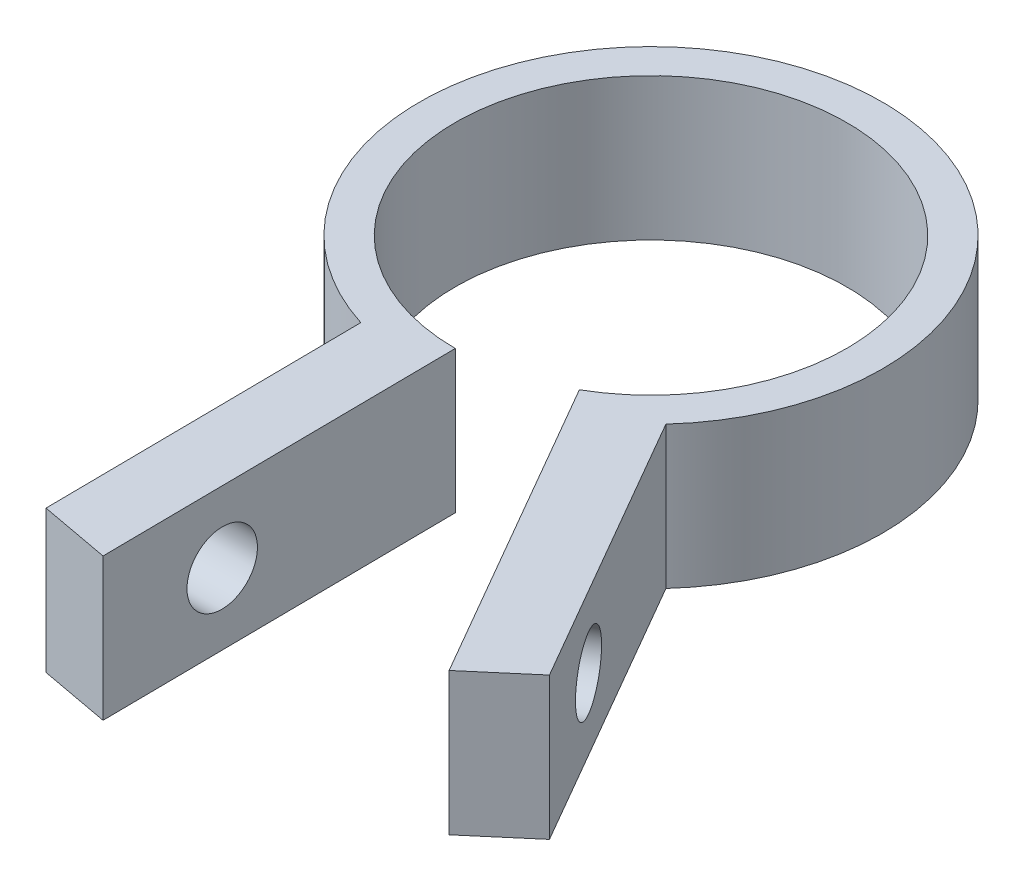
ISO-10303-21;
HEADER;
FILE_DESCRIPTION(('STEP AP214'),'2;1');
FILE_NAME('part.step','',(''),(''),'','','');
FILE_SCHEMA(('AUTOMOTIVE_DESIGN { 1 0 10303 214 1 1 1 1 }'));
ENDSEC;
DATA;
#1=APPLICATION_CONTEXT('core data for automotive mechanical design processes');
#2=APPLICATION_PROTOCOL_DEFINITION('international standard','automotive_design',2000,#1);
#3=PRODUCT_CONTEXT('',#1,'mechanical');
#4=PRODUCT('Part','Part','',(#3));
#5=PRODUCT_RELATED_PRODUCT_CATEGORY('part','',(#4));
#6=PRODUCT_DEFINITION_FORMATION('','',#4);
#7=PRODUCT_DEFINITION_CONTEXT('part definition',#1,'design');
#8=PRODUCT_DEFINITION('design','',#6,#7);
#9=PRODUCT_DEFINITION_SHAPE('','',#8);
#10=(LENGTH_UNIT() NAMED_UNIT(*) SI_UNIT(.MILLI.,.METRE.));
#11=(NAMED_UNIT(*) PLANE_ANGLE_UNIT() SI_UNIT($,.RADIAN.));
#12=(NAMED_UNIT(*) SI_UNIT($,.STERADIAN.) SOLID_ANGLE_UNIT());
#13=UNCERTAINTY_MEASURE_WITH_UNIT(LENGTH_MEASURE(1.E-05),#10,'distance_accuracy_value','');
#14=(GEOMETRIC_REPRESENTATION_CONTEXT(3) GLOBAL_UNCERTAINTY_ASSIGNED_CONTEXT((#13)) GLOBAL_UNIT_ASSIGNED_CONTEXT((#10,
#11,#12)) REPRESENTATION_CONTEXT('',''));
#15=CARTESIAN_POINT('',(0.,0.,0.));
#16=DIRECTION('',(0.,0.,1.));
#17=DIRECTION('',(1.,0.,0.));
#18=AXIS2_PLACEMENT_3D('',#15,#16,#17);
#19=CARTESIAN_POINT('',(0.,4.,0.));
#20=DIRECTION('',(0.,-1.,0.));
#21=DIRECTION('',(0.,0.,-1.));
#22=AXIS2_PLACEMENT_3D('',#19,#20,#21);
#23=CYLINDRICAL_SURFACE('',#22,5.5);
#24=CARTESIAN_POINT('',(0.,0.,0.));
#25=DIRECTION('',(0.,1.,0.));
#26=DIRECTION('',(0.,0.,1.));
#27=AXIS2_PLACEMENT_3D('',#24,#25,#26);
#28=CIRCLE('',#27,5.5);
#29=CARTESIAN_POINT('',(2.75000000000001,0.,4.76313972081441));
#30=VERTEX_POINT('',#29);
#31=CARTESIAN_POINT('',(0.,0.,5.5));
#32=VERTEX_POINT('',#31);
#33=EDGE_CURVE('E131',#30,#32,#28,.T.);
#34=ORIENTED_EDGE('',*,*,#33,.F.);
#35=DIRECTION('',(0.,-1.,0.));
#36=VECTOR('',#35,1.);
#37=CARTESIAN_POINT('',(2.75000000000001,4.,4.76313972081441));
#38=LINE('',#37,#36);
#39=CARTESIAN_POINT('',(2.75000000000001,4.,4.76313972081441));
#40=VERTEX_POINT('',#39);
#41=EDGE_CURVE('E11',#40,#30,#38,.T.);
#42=ORIENTED_EDGE('',*,*,#41,.F.);
#43=CARTESIAN_POINT('',(0.,4.,0.));
#44=DIRECTION('',(0.,1.,0.));
#45=DIRECTION('',(0.,0.,1.));
#46=AXIS2_PLACEMENT_3D('',#43,#44,#45);
#47=CIRCLE('',#46,5.5);
#48=CARTESIAN_POINT('',(0.,4.,5.5));
#49=VERTEX_POINT('',#48);
#50=EDGE_CURVE('E150',#40,#49,#47,.T.);
#51=ORIENTED_EDGE('',*,*,#50,.T.);
#52=DIRECTION('',(0.,-1.,0.));
#53=VECTOR('',#52,1.);
#54=CARTESIAN_POINT('',(0.,4.,5.5));
#55=LINE('',#54,#53);
#56=EDGE_CURVE('E52',#49,#32,#55,.T.);
#57=ORIENTED_EDGE('',*,*,#56,.T.);
#58=EDGE_LOOP('',(#34,#42,#51,#57));
#59=FACE_BOUND('',#58,.T.);
#60=ADVANCED_FACE('F36',(#59),#23,.F.);
#61=CARTESIAN_POINT('',(0.,4.,0.));
#62=DIRECTION('',(0.866025403784438,0.,-0.500000000000001));
#63=DIRECTION('',(-0.500000000000001,0.,-0.866025403784438));
#64=AXIS2_PLACEMENT_3D('',#61,#62,#63);
#65=PLANE('',#64);
#66=CARTESIAN_POINT('',(6.06818181818184,2.,10.5103992186566));
#67=DIRECTION('',(0.866025403784438,0.,-0.500000000000001));
#68=DIRECTION('',(-0.500000000000001,0.,-0.866025403784438));
#69=AXIS2_PLACEMENT_3D('',#66,#67,#68);
#70=CIRCLE('',#69,1.);
#71=CARTESIAN_POINT('',(5.56818181818184,2.,9.64437381487216));
#72=VERTEX_POINT('',#71);
#73=EDGE_CURVE('E184',#72,#72,#70,.F.);
#74=ORIENTED_EDGE('',*,*,#73,.F.);
#75=EDGE_LOOP('',(#74));
#76=FACE_BOUND('',#75,.T.);
#77=DIRECTION('',(0.500000000000001,0.,0.866025403784438));
#78=VECTOR('',#77,1.);
#79=CARTESIAN_POINT('',(0.,0.,0.));
#80=LINE('',#79,#78);
#81=CARTESIAN_POINT('',(7.75000000000002,0.,13.4233937586588));
#82=VERTEX_POINT('',#81);
#83=EDGE_CURVE('E133',#30,#82,#80,.T.);
#84=ORIENTED_EDGE('',*,*,#83,.T.);
#85=DIRECTION('',(0.,-1.,0.));
#86=VECTOR('',#85,1.);
#87=CARTESIAN_POINT('',(7.75000000000002,4.,13.4233937586588));
#88=LINE('',#87,#86);
#89=CARTESIAN_POINT('',(7.75000000000002,4.,13.4233937586588));
#90=VERTEX_POINT('',#89);
#91=EDGE_CURVE('E44',#90,#82,#88,.T.);
#92=ORIENTED_EDGE('',*,*,#91,.F.);
#93=DIRECTION('',(0.500000000000001,0.,0.866025403784438));
#94=VECTOR('',#93,1.);
#95=CARTESIAN_POINT('',(0.,4.,0.));
#96=LINE('',#95,#94);
#97=EDGE_CURVE('E176',#40,#90,#96,.T.);
#98=ORIENTED_EDGE('',*,*,#97,.F.);
#99=ORIENTED_EDGE('',*,*,#41,.T.);
#100=EDGE_LOOP('',(#84,#92,#98,#99));
#101=FACE_BOUND('',#100,.T.);
#102=ADVANCED_FACE('F195',(#76,#101),#65,.F.);
#103=CARTESIAN_POINT('',(9.89373890021097,4.,11.5940407888761));
#104=DIRECTION('',(-0.649125247342261,0.,-0.760681545236144));
#105=DIRECTION('',(-0.760681545236144,0.,0.649125247342261));
#106=AXIS2_PLACEMENT_3D('',#103,#104,#105);
#107=PLANE('',#106);
#108=DIRECTION('',(0.760681545236145,0.,-0.649125247342261));
#109=VECTOR('',#108,1.);
#110=CARTESIAN_POINT('',(9.89373890021097,0.,11.5940407888761));
#111=LINE('',#110,#109);
#112=CARTESIAN_POINT('',(9.2713630904723,0.,12.1251432639743));
#113=VERTEX_POINT('',#112);
#114=EDGE_CURVE('E136',#82,#113,#111,.T.);
#115=ORIENTED_EDGE('',*,*,#114,.T.);
#116=DIRECTION('',(0.,-1.,0.));
#117=VECTOR('',#116,1.);
#118=CARTESIAN_POINT('',(9.2713630904723,4.,12.1251432639743));
#119=LINE('',#118,#117);
#120=CARTESIAN_POINT('',(9.2713630904723,4.,12.1251432639743));
#121=VERTEX_POINT('',#120);
#122=EDGE_CURVE('E156',#121,#113,#119,.T.);
#123=ORIENTED_EDGE('',*,*,#122,.F.);
#124=DIRECTION('',(0.760681545236145,0.,-0.649125247342261));
#125=VECTOR('',#124,1.);
#126=CARTESIAN_POINT('',(9.89373890021097,4.,11.5940407888761));
#127=LINE('',#126,#125);
#128=EDGE_CURVE('E164',#90,#121,#127,.T.);
#129=ORIENTED_EDGE('',*,*,#128,.F.);
#130=ORIENTED_EDGE('',*,*,#91,.T.);
#131=EDGE_LOOP('',(#115,#123,#129,#130));
#132=FACE_BOUND('',#131,.T.);
#133=ADVANCED_FACE('F162',(#132),#107,.F.);
#134=CARTESIAN_POINT('',(1.70318127229047,4.,-0.983332166035637));
#135=DIRECTION('',(0.866025403784438,0.,-0.500000000000001));
#136=DIRECTION('',(-0.500000000000001,0.,-0.866025403784438));
#137=AXIS2_PLACEMENT_3D('',#134,#135,#136);
#138=PLANE('',#137);
#139=CARTESIAN_POINT('',(7.77136309047232,2.,9.52706705262095));
#140=DIRECTION('',(0.866025403784438,0.,-0.500000000000002));
#141=DIRECTION('',(-0.500000000000002,0.,-0.866025403784438));
#142=AXIS2_PLACEMENT_3D('',#139,#140,#141);
#143=CIRCLE('',#142,1.);
#144=CARTESIAN_POINT('',(7.27136309047232,2.,8.66104164883651));
#145=VERTEX_POINT('',#144);
#146=EDGE_CURVE('E187',#145,#145,#143,.T.);
#147=ORIENTED_EDGE('',*,*,#146,.F.);
#148=EDGE_LOOP('',(#147));
#149=FACE_BOUND('',#148,.T.);
#150=DIRECTION('',(0.500000000000001,0.,0.866025403784438));
#151=VECTOR('',#150,1.);
#152=CARTESIAN_POINT('',(1.70318127229047,0.,-0.983332166035637));
#153=LINE('',#152,#151);
#154=CARTESIAN_POINT('',(4.80085101763773,0.,4.38198921797474));
#155=VERTEX_POINT('',#154);
#156=EDGE_CURVE('E139',#155,#113,#153,.T.);
#157=ORIENTED_EDGE('',*,*,#156,.F.);
#158=DIRECTION('',(0.,-1.,0.));
#159=VECTOR('',#158,1.);
#160=CARTESIAN_POINT('',(4.80085101763773,4.,4.38198921797474));
#161=LINE('',#160,#159);
#162=CARTESIAN_POINT('',(4.80085101763773,4.,4.38198921797474));
#163=VERTEX_POINT('',#162);
#164=EDGE_CURVE('E154',#163,#155,#161,.T.);
#165=ORIENTED_EDGE('',*,*,#164,.F.);
#166=DIRECTION('',(0.500000000000001,0.,0.866025403784438));
#167=VECTOR('',#166,1.);
#168=CARTESIAN_POINT('',(1.70318127229047,4.,-0.983332166035637));
#169=LINE('',#168,#167);
#170=EDGE_CURVE('E174',#163,#121,#169,.T.);
#171=ORIENTED_EDGE('',*,*,#170,.T.);
#172=ORIENTED_EDGE('',*,*,#122,.T.);
#173=EDGE_LOOP('',(#157,#165,#171,#172));
#174=FACE_BOUND('',#173,.T.);
#175=ADVANCED_FACE('F172',(#149,#174),#138,.T.);
#176=CARTESIAN_POINT('',(0.,4.,0.));
#177=DIRECTION('',(0.,-1.,0.));
#178=DIRECTION('',(0.,0.,-1.));
#179=AXIS2_PLACEMENT_3D('',#176,#177,#178);
#180=CYLINDRICAL_SURFACE('',#179,6.5);
#181=CARTESIAN_POINT('',(0.,0.,0.));
#182=DIRECTION('',(0.,1.,0.));
#183=DIRECTION('',(0.,0.,1.));
#184=AXIS2_PLACEMENT_3D('',#181,#182,#183);
#185=CIRCLE('',#184,6.5);
#186=CARTESIAN_POINT('',(-1.95588544418359,0.,6.19875085232749));
#187=VERTEX_POINT('',#186);
#188=EDGE_CURVE('E142',#155,#187,#185,.T.);
#189=ORIENTED_EDGE('',*,*,#188,.T.);
#190=DIRECTION('',(0.,-1.,0.));
#191=VECTOR('',#190,1.);
#192=CARTESIAN_POINT('',(-1.95588544418359,4.,6.19875085232749));
#193=LINE('',#192,#191);
#194=CARTESIAN_POINT('',(-1.95588544418359,4.,6.19875085232749));
#195=VERTEX_POINT('',#194);
#196=EDGE_CURVE('E123',#195,#187,#193,.T.);
#197=ORIENTED_EDGE('',*,*,#196,.F.);
#198=CARTESIAN_POINT('',(0.,4.,0.));
#199=DIRECTION('',(0.,1.,0.));
#200=DIRECTION('',(0.,0.,1.));
#201=AXIS2_PLACEMENT_3D('',#198,#199,#200);
#202=CIRCLE('',#201,6.5);
#203=EDGE_CURVE('E111',#163,#195,#202,.T.);
#204=ORIENTED_EDGE('',*,*,#203,.F.);
#205=ORIENTED_EDGE('',*,*,#164,.T.);
#206=EDGE_LOOP('',(#189,#197,#204,#205));
#207=FACE_BOUND('',#206,.T.);
#208=ADVANCED_FACE('F218',(#207),#180,.T.);
#209=CARTESIAN_POINT('',(-2.01856963819872,4.,0.0204802312157562));
#210=DIRECTION('',(0.999948534201672,0.,-0.0101453904768832));
#211=DIRECTION('',(-0.0101453904768832,0.,-0.999948534201672));
#212=AXIS2_PLACEMENT_3D('',#209,#210,#211);
#213=PLANE('',#212);
#214=CARTESIAN_POINT('',(-1.89564659873308,2.,12.1360033757753));
#215=DIRECTION('',(-0.999948534201672,0.,0.0101453904768832));
#216=DIRECTION('',(0.0101453904768832,0.,0.999948534201672));
#217=AXIS2_PLACEMENT_3D('',#214,#215,#216);
#218=CIRCLE('',#217,1.);
#219=CARTESIAN_POINT('',(-1.8855012082562,2.,13.135951909977));
#220=VERTEX_POINT('',#219);
#221=EDGE_CURVE('E134',#220,#220,#218,.T.);
#222=ORIENTED_EDGE('',*,*,#221,.F.);
#223=EDGE_LOOP('',(#222));
#224=FACE_BOUND('',#223,.T.);
#225=DIRECTION('',(0.0101453904768832,0.,0.999948534201672));
#226=VECTOR('',#225,1.);
#227=CARTESIAN_POINT('',(-2.01856963819872,0.,0.0204802312157562));
#228=LINE('',#227,#226);
#229=CARTESIAN_POINT('',(-1.86521042730243,0.,15.1358489783804));
#230=VERTEX_POINT('',#229);
#231=EDGE_CURVE('E120',#187,#230,#228,.T.);
#232=ORIENTED_EDGE('',*,*,#231,.T.);
#233=DIRECTION('',(0.,-1.,0.));
#234=VECTOR('',#233,1.);
#235=CARTESIAN_POINT('',(-1.86521042730243,4.,15.1358489783804));
#236=LINE('',#235,#234);
#237=CARTESIAN_POINT('',(-1.86521042730243,4.,15.1358489783804));
#238=VERTEX_POINT('',#237);
#239=EDGE_CURVE('E117',#238,#230,#236,.T.);
#240=ORIENTED_EDGE('',*,*,#239,.F.);
#241=DIRECTION('',(0.0101453904768832,0.,0.999948534201672));
#242=VECTOR('',#241,1.);
#243=CARTESIAN_POINT('',(-2.01856963819872,4.,0.0204802312157562));
#244=LINE('',#243,#242);
#245=EDGE_CURVE('E102',#195,#238,#244,.T.);
#246=ORIENTED_EDGE('',*,*,#245,.F.);
#247=ORIENTED_EDGE('',*,*,#196,.T.);
#248=EDGE_LOOP('',(#232,#240,#246,#247));
#249=FACE_BOUND('',#248,.T.);
#250=ADVANCED_FACE('F118',(#224,#249),#213,.F.);
#251=CARTESIAN_POINT('',(-2.76776296896353,4.,14.9689669543927));
#252=DIRECTION('',(-0.181818181818181,0.,0.983332166035634));
#253=DIRECTION('',(0.983332166035634,0.,0.181818181818181));
#254=AXIS2_PLACEMENT_3D('',#251,#252,#253);
#255=PLANE('',#254);
#256=DIRECTION('',(-0.983332166035634,0.,-0.181818181818181));
#257=VECTOR('',#256,1.);
#258=CARTESIAN_POINT('',(-2.76776296896353,0.,14.9689669543927));
#259=LINE('',#258,#257);
#260=CARTESIAN_POINT('',(0.101453904768832,0.,15.4994853420167));
#261=VERTEX_POINT('',#260);
#262=EDGE_CURVE('E145',#261,#230,#259,.T.);
#263=ORIENTED_EDGE('',*,*,#262,.F.);
#264=DIRECTION('',(0.,-1.,0.));
#265=VECTOR('',#264,1.);
#266=CARTESIAN_POINT('',(0.101453904768832,4.,15.4994853420167));
#267=LINE('',#266,#265);
#268=CARTESIAN_POINT('',(0.101453904768832,4.,15.4994853420167));
#269=VERTEX_POINT('',#268);
#270=EDGE_CURVE('E77',#269,#261,#267,.T.);
#271=ORIENTED_EDGE('',*,*,#270,.F.);
#272=DIRECTION('',(-0.983332166035634,0.,-0.181818181818181));
#273=VECTOR('',#272,1.);
#274=CARTESIAN_POINT('',(-2.76776296896353,4.,14.9689669543927));
#275=LINE('',#274,#273);
#276=EDGE_CURVE('E108',#269,#238,#275,.T.);
#277=ORIENTED_EDGE('',*,*,#276,.T.);
#278=ORIENTED_EDGE('',*,*,#239,.T.);
#279=EDGE_LOOP('',(#263,#271,#277,#278));
#280=FACE_BOUND('',#279,.T.);
#281=ADVANCED_FACE('F125',(#280),#255,.T.);
#282=CARTESIAN_POINT('',(-0.0557967758494464,4.,0.00056610921360638));
#283=DIRECTION('',(0.999948534201672,0.,-0.0101453904768832));
#284=DIRECTION('',(-0.0101453904768832,0.,-0.999948534201672));
#285=AXIS2_PLACEMENT_3D('',#282,#283,#284);
#286=PLANE('',#285);
#287=CARTESIAN_POINT('',(0.0671262636161851,2.,12.1160892537732));
#288=DIRECTION('',(0.999948534201672,0.,-0.0101453904768832));
#289=DIRECTION('',(-0.0101453904768832,0.,-0.999948534201672));
#290=AXIS2_PLACEMENT_3D('',#287,#288,#289);
#291=CIRCLE('',#290,1.);
#292=CARTESIAN_POINT('',(0.0569808731393019,2.,11.1161407195715));
#293=VERTEX_POINT('',#292);
#294=EDGE_CURVE('E181',#293,#293,#291,.F.);
#295=ORIENTED_EDGE('',*,*,#294,.T.);
#296=EDGE_LOOP('',(#295));
#297=FACE_BOUND('',#296,.T.);
#298=DIRECTION('',(0.0101453904768832,0.,0.999948534201672));
#299=VECTOR('',#298,1.);
#300=CARTESIAN_POINT('',(-0.0557967758494464,0.,0.00056610921360638));
#301=LINE('',#300,#299);
#302=EDGE_CURVE('E147',#32,#261,#301,.T.);
#303=ORIENTED_EDGE('',*,*,#302,.F.);
#304=ORIENTED_EDGE('',*,*,#56,.F.);
#305=DIRECTION('',(0.0101453904768832,0.,0.999948534201672));
#306=VECTOR('',#305,1.);
#307=CARTESIAN_POINT('',(-0.0557967758494464,4.,0.00056610921360638));
#308=LINE('',#307,#306);
#309=EDGE_CURVE('E126',#49,#269,#308,.T.);
#310=ORIENTED_EDGE('',*,*,#309,.T.);
#311=ORIENTED_EDGE('',*,*,#270,.T.);
#312=EDGE_LOOP('',(#303,#304,#310,#311));
#313=FACE_BOUND('',#312,.T.);
#314=ADVANCED_FACE('F242',(#297,#313),#286,.T.);
#315=CARTESIAN_POINT('',(0.,4.,0.));
#316=DIRECTION('',(0.,1.,0.));
#317=DIRECTION('',(0.,0.,1.));
#318=AXIS2_PLACEMENT_3D('',#315,#316,#317);
#319=PLANE('',#318);
#320=ORIENTED_EDGE('',*,*,#50,.F.);
#321=ORIENTED_EDGE('',*,*,#97,.T.);
#322=ORIENTED_EDGE('',*,*,#128,.T.);
#323=ORIENTED_EDGE('',*,*,#170,.F.);
#324=ORIENTED_EDGE('',*,*,#203,.T.);
#325=ORIENTED_EDGE('',*,*,#245,.T.);
#326=ORIENTED_EDGE('',*,*,#276,.F.);
#327=ORIENTED_EDGE('',*,*,#309,.F.);
#328=EDGE_LOOP('',(#320,#321,#322,#323,#324,#325,#326,#327));
#329=FACE_BOUND('',#328,.T.);
#330=ADVANCED_FACE('F105',(#329),#319,.T.);
#331=CARTESIAN_POINT('',(0.,0.,0.));
#332=DIRECTION('',(0.,1.,0.));
#333=DIRECTION('',(0.,0.,1.));
#334=AXIS2_PLACEMENT_3D('',#331,#332,#333);
#335=PLANE('',#334);
#336=ORIENTED_EDGE('',*,*,#33,.T.);
#337=ORIENTED_EDGE('',*,*,#302,.T.);
#338=ORIENTED_EDGE('',*,*,#262,.T.);
#339=ORIENTED_EDGE('',*,*,#231,.F.);
#340=ORIENTED_EDGE('',*,*,#188,.F.);
#341=ORIENTED_EDGE('',*,*,#156,.T.);
#342=ORIENTED_EDGE('',*,*,#114,.F.);
#343=ORIENTED_EDGE('',*,*,#83,.F.);
#344=EDGE_LOOP('',(#336,#337,#338,#339,#340,#341,#342,#343));
#345=FACE_BOUND('',#344,.T.);
#346=ADVANCED_FACE('F168',(#345),#335,.F.);
#347=CARTESIAN_POINT('',(9.46028352441427,2.,12.0207871007502));
#348=DIRECTION('',(-0.999948534201672,0.,0.0101453904768832));
#349=DIRECTION('',(0.0101453904768832,0.,0.999948534201672));
#350=AXIS2_PLACEMENT_3D('',#347,#348,#349);
#351=CYLINDRICAL_SURFACE('',#350,1.);
#352=ORIENTED_EDGE('',*,*,#294,.F.);
#353=EDGE_LOOP('',(#352));
#354=FACE_BOUND('',#353,.T.);
#355=ORIENTED_EDGE('',*,*,#221,.T.);
#356=EDGE_LOOP('',(#355));
#357=FACE_BOUND('',#356,.T.);
#358=ADVANCED_FACE('F260',(#354,#357),#351,.F.);
#359=CARTESIAN_POINT('',(-5.51947522040556,2.,17.2005361291621));
#360=DIRECTION('',(0.866025403784437,0.,-0.500000000000002));
#361=DIRECTION('',(-0.500000000000002,0.,-0.866025403784438));
#362=AXIS2_PLACEMENT_3D('',#359,#360,#361);
#363=CYLINDRICAL_SURFACE('',#362,1.);
#364=ORIENTED_EDGE('',*,*,#146,.T.);
#365=EDGE_LOOP('',(#364));
#366=FACE_BOUND('',#365,.T.);
#367=ORIENTED_EDGE('',*,*,#73,.T.);
#368=EDGE_LOOP('',(#367));
#369=FACE_BOUND('',#368,.T.);
#370=ADVANCED_FACE('F193',(#366,#369),#363,.F.);
#371=CLOSED_SHELL('',(#60,#102,#133,#175,#208,#250,#281,#314,#330,#346,#358,#370));
#372=MANIFOLD_SOLID_BREP('B2',#371);
#373=ADVANCED_BREP_SHAPE_REPRESENTATION('',(#18,#372),#14);
#374=SHAPE_DEFINITION_REPRESENTATION(#9,#373);
ENDSEC;
END-ISO-10303-21;
